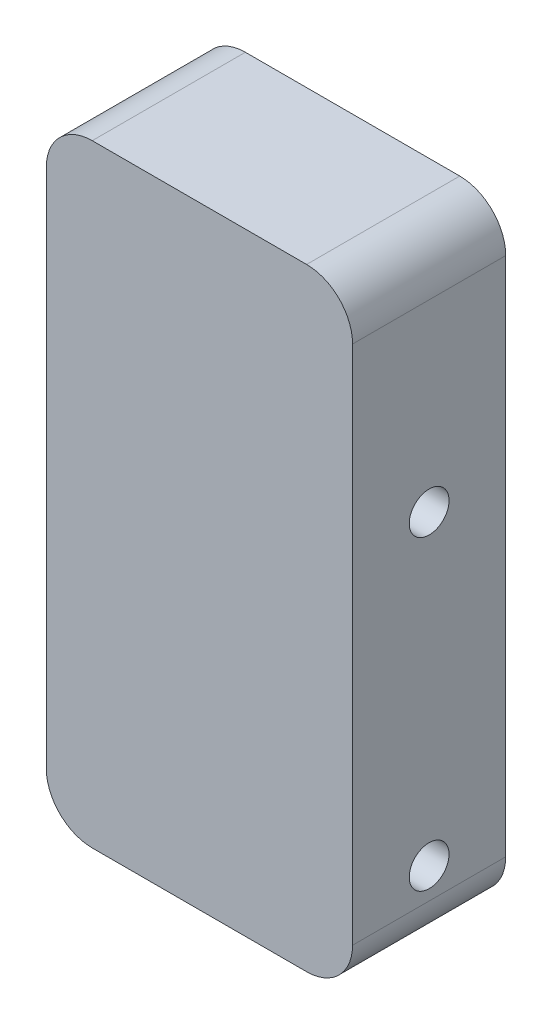
ISO-10303-21;
HEADER;
FILE_DESCRIPTION(('STEP AP214'),'2;1');
FILE_NAME('part.step','',(''),(''),'','','');
FILE_SCHEMA(('AUTOMOTIVE_DESIGN { 1 0 10303 214 1 1 1 1 }'));
ENDSEC;
DATA;
#1=APPLICATION_CONTEXT('core data for automotive mechanical design processes');
#2=APPLICATION_PROTOCOL_DEFINITION('international standard','automotive_design',2000,#1);
#3=PRODUCT_CONTEXT('',#1,'mechanical');
#4=PRODUCT('Part','Part','',(#3));
#5=PRODUCT_RELATED_PRODUCT_CATEGORY('part','',(#4));
#6=PRODUCT_DEFINITION_FORMATION('','',#4);
#7=PRODUCT_DEFINITION_CONTEXT('part definition',#1,'design');
#8=PRODUCT_DEFINITION('design','',#6,#7);
#9=PRODUCT_DEFINITION_SHAPE('','',#8);
#10=(LENGTH_UNIT() NAMED_UNIT(*) SI_UNIT(.MILLI.,.METRE.));
#11=(NAMED_UNIT(*) PLANE_ANGLE_UNIT() SI_UNIT($,.RADIAN.));
#12=(NAMED_UNIT(*) SI_UNIT($,.STERADIAN.) SOLID_ANGLE_UNIT());
#13=UNCERTAINTY_MEASURE_WITH_UNIT(LENGTH_MEASURE(1.E-05),#10,'distance_accuracy_value','');
#14=(GEOMETRIC_REPRESENTATION_CONTEXT(3) GLOBAL_UNCERTAINTY_ASSIGNED_CONTEXT((#13)) GLOBAL_UNIT_ASSIGNED_CONTEXT((#10,
#11,#12)) REPRESENTATION_CONTEXT('',''));
#15=CARTESIAN_POINT('',(0.,0.,0.));
#16=DIRECTION('',(0.,0.,1.));
#17=DIRECTION('',(1.,0.,0.));
#18=AXIS2_PLACEMENT_3D('',#15,#16,#17);
#19=CARTESIAN_POINT('',(-10.,20.,10.));
#20=DIRECTION('',(1.,0.,0.));
#21=DIRECTION('',(0.,1.,0.));
#22=AXIS2_PLACEMENT_3D('',#19,#20,#21);
#23=PLANE('',#22);
#24=DIRECTION('',(0.,-1.,0.));
#25=VECTOR('',#24,1.);
#26=CARTESIAN_POINT('',(-10.,20.,10.));
#27=LINE('',#26,#25);
#28=CARTESIAN_POINT('',(-10.,17.,10.));
#29=VERTEX_POINT('',#28);
#30=CARTESIAN_POINT('',(-10.,-17.,10.));
#31=VERTEX_POINT('',#30);
#32=EDGE_CURVE('E120',#29,#31,#27,.T.);
#33=ORIENTED_EDGE('',*,*,#32,.F.);
#34=DIRECTION('',(0.,0.,-1.));
#35=VECTOR('',#34,1.);
#36=CARTESIAN_POINT('',(-10.,17.,10.));
#37=LINE('',#36,#35);
#38=CARTESIAN_POINT('',(-10.,17.,0.));
#39=VERTEX_POINT('',#38);
#40=EDGE_CURVE('E105',#29,#39,#37,.T.);
#41=ORIENTED_EDGE('',*,*,#40,.T.);
#42=DIRECTION('',(0.,-1.,0.));
#43=VECTOR('',#42,1.);
#44=CARTESIAN_POINT('',(-10.,20.,0.));
#45=LINE('',#44,#43);
#46=CARTESIAN_POINT('',(-10.,-17.,0.));
#47=VERTEX_POINT('',#46);
#48=EDGE_CURVE('E117',#39,#47,#45,.T.);
#49=ORIENTED_EDGE('',*,*,#48,.T.);
#50=DIRECTION('',(0.,0.,-1.));
#51=VECTOR('',#50,1.);
#52=CARTESIAN_POINT('',(-10.,-17.,10.));
#53=LINE('',#52,#51);
#54=EDGE_CURVE('E122',#47,#31,#53,.F.);
#55=ORIENTED_EDGE('',*,*,#54,.T.);
#56=EDGE_LOOP('',(#33,#41,#49,#55));
#57=FACE_BOUND('',#56,.T.);
#58=ADVANCED_FACE('F35',(#57),#23,.F.);
#59=CARTESIAN_POINT('',(10.,-20.,10.));
#60=DIRECTION('',(0.,1.,0.));
#61=DIRECTION('',(-1.,0.,0.));
#62=AXIS2_PLACEMENT_3D('',#59,#60,#61);
#63=PLANE('',#62);
#64=DIRECTION('',(1.,0.,0.));
#65=VECTOR('',#64,1.);
#66=CARTESIAN_POINT('',(10.,-20.,10.));
#67=LINE('',#66,#65);
#68=CARTESIAN_POINT('',(-7.,-20.,10.));
#69=VERTEX_POINT('',#68);
#70=CARTESIAN_POINT('',(7.,-20.,10.));
#71=VERTEX_POINT('',#70);
#72=EDGE_CURVE('E166',#69,#71,#67,.T.);
#73=ORIENTED_EDGE('',*,*,#72,.F.);
#74=DIRECTION('',(0.,0.,-1.));
#75=VECTOR('',#74,1.);
#76=CARTESIAN_POINT('',(-7.,-20.,10.));
#77=LINE('',#76,#75);
#78=CARTESIAN_POINT('',(-7.,-20.,0.));
#79=VERTEX_POINT('',#78);
#80=EDGE_CURVE('E159',#69,#79,#77,.T.);
#81=ORIENTED_EDGE('',*,*,#80,.T.);
#82=DIRECTION('',(1.,0.,0.));
#83=VECTOR('',#82,1.);
#84=CARTESIAN_POINT('',(10.,-20.,0.));
#85=LINE('',#84,#83);
#86=CARTESIAN_POINT('',(7.,-20.,0.));
#87=VERTEX_POINT('',#86);
#88=EDGE_CURVE('E126',#79,#87,#85,.T.);
#89=ORIENTED_EDGE('',*,*,#88,.T.);
#90=DIRECTION('',(0.,0.,-1.));
#91=VECTOR('',#90,1.);
#92=CARTESIAN_POINT('',(7.,-20.,10.));
#93=LINE('',#92,#91);
#94=EDGE_CURVE('E157',#87,#71,#93,.F.);
#95=ORIENTED_EDGE('',*,*,#94,.T.);
#96=EDGE_LOOP('',(#73,#81,#89,#95));
#97=FACE_BOUND('',#96,.T.);
#98=ADVANCED_FACE('F164',(#97),#63,.F.);
#99=CARTESIAN_POINT('',(9.99999999999999,20.,10.));
#100=DIRECTION('',(-1.,0.,0.));
#101=DIRECTION('',(0.,-1.,0.));
#102=AXIS2_PLACEMENT_3D('',#99,#100,#101);
#103=PLANE('',#102);
#104=CARTESIAN_POINT('',(10.,-15.,5.));
#105=DIRECTION('',(1.,0.,0.));
#106=DIRECTION('',(0.,0.,-1.));
#107=AXIS2_PLACEMENT_3D('',#104,#105,#106);
#108=CIRCLE('',#107,1.3);
#109=CARTESIAN_POINT('',(10.,-15.,3.7));
#110=VERTEX_POINT('',#109);
#111=EDGE_CURVE('E133',#110,#110,#108,.T.);
#112=ORIENTED_EDGE('',*,*,#111,.F.);
#113=EDGE_LOOP('',(#112));
#114=FACE_BOUND('',#113,.T.);
#115=CARTESIAN_POINT('',(10.,5.00000000000001,5.));
#116=DIRECTION('',(1.,0.,0.));
#117=DIRECTION('',(0.,0.,-1.));
#118=AXIS2_PLACEMENT_3D('',#115,#116,#117);
#119=CIRCLE('',#118,1.3);
#120=CARTESIAN_POINT('',(10.,5.00000000000001,3.7));
#121=VERTEX_POINT('',#120);
#122=EDGE_CURVE('E180',#121,#121,#119,.T.);
#123=ORIENTED_EDGE('',*,*,#122,.F.);
#124=EDGE_LOOP('',(#123));
#125=FACE_BOUND('',#124,.T.);
#126=DIRECTION('',(0.,1.,0.));
#127=VECTOR('',#126,1.);
#128=CARTESIAN_POINT('',(9.99999999999999,20.,10.));
#129=LINE('',#128,#127);
#130=CARTESIAN_POINT('',(10.,-17.,10.));
#131=VERTEX_POINT('',#130);
#132=CARTESIAN_POINT('',(9.99999999999999,17.,10.));
#133=VERTEX_POINT('',#132);
#134=EDGE_CURVE('E174',#131,#133,#129,.T.);
#135=ORIENTED_EDGE('',*,*,#134,.F.);
#136=DIRECTION('',(0.,0.,-1.));
#137=VECTOR('',#136,1.);
#138=CARTESIAN_POINT('',(10.,-17.,10.));
#139=LINE('',#138,#137);
#140=CARTESIAN_POINT('',(10.,-17.,0.));
#141=VERTEX_POINT('',#140);
#142=EDGE_CURVE('E11',#131,#141,#139,.T.);
#143=ORIENTED_EDGE('',*,*,#142,.T.);
#144=DIRECTION('',(0.,1.,0.));
#145=VECTOR('',#144,1.);
#146=CARTESIAN_POINT('',(9.99999999999999,20.,0.));
#147=LINE('',#146,#145);
#148=CARTESIAN_POINT('',(9.99999999999999,17.,0.));
#149=VERTEX_POINT('',#148);
#150=EDGE_CURVE('E130',#141,#149,#147,.T.);
#151=ORIENTED_EDGE('',*,*,#150,.T.);
#152=DIRECTION('',(0.,0.,-1.));
#153=VECTOR('',#152,1.);
#154=CARTESIAN_POINT('',(9.99999999999999,17.,10.));
#155=LINE('',#154,#153);
#156=EDGE_CURVE('E43',#149,#133,#155,.F.);
#157=ORIENTED_EDGE('',*,*,#156,.T.);
#158=EDGE_LOOP('',(#135,#143,#151,#157));
#159=FACE_BOUND('',#158,.T.);
#160=ADVANCED_FACE('F173',(#114,#125,#159),#103,.F.);
#161=CARTESIAN_POINT('',(9.99999999999999,20.,10.));
#162=DIRECTION('',(0.,-1.,0.));
#163=DIRECTION('',(1.,0.,0.));
#164=AXIS2_PLACEMENT_3D('',#161,#162,#163);
#165=PLANE('',#164);
#166=DIRECTION('',(-1.,0.,0.));
#167=VECTOR('',#166,1.);
#168=CARTESIAN_POINT('',(9.99999999999999,20.,0.));
#169=LINE('',#168,#167);
#170=CARTESIAN_POINT('',(6.99999999999999,20.,0.));
#171=VERTEX_POINT('',#170);
#172=CARTESIAN_POINT('',(-7.00000000000001,20.,0.));
#173=VERTEX_POINT('',#172);
#174=EDGE_CURVE('E140',#171,#173,#169,.T.);
#175=ORIENTED_EDGE('',*,*,#174,.T.);
#176=DIRECTION('',(0.,0.,-1.));
#177=VECTOR('',#176,1.);
#178=CARTESIAN_POINT('',(-7.00000000000001,20.,10.));
#179=LINE('',#178,#177);
#180=CARTESIAN_POINT('',(-7.00000000000001,20.,10.));
#181=VERTEX_POINT('',#180);
#182=EDGE_CURVE('E106',#173,#181,#179,.F.);
#183=ORIENTED_EDGE('',*,*,#182,.T.);
#184=DIRECTION('',(-1.,0.,0.));
#185=VECTOR('',#184,1.);
#186=CARTESIAN_POINT('',(9.99999999999999,20.,10.));
#187=LINE('',#186,#185);
#188=CARTESIAN_POINT('',(6.99999999999999,20.,10.));
#189=VERTEX_POINT('',#188);
#190=EDGE_CURVE('E136',#189,#181,#187,.T.);
#191=ORIENTED_EDGE('',*,*,#190,.F.);
#192=DIRECTION('',(0.,0.,-1.));
#193=VECTOR('',#192,1.);
#194=CARTESIAN_POINT('',(6.99999999999999,20.,10.));
#195=LINE('',#194,#193);
#196=EDGE_CURVE('E111',#189,#171,#195,.T.);
#197=ORIENTED_EDGE('',*,*,#196,.T.);
#198=EDGE_LOOP('',(#175,#183,#191,#197));
#199=FACE_BOUND('',#198,.T.);
#200=ADVANCED_FACE('F193',(#199),#165,.F.);
#201=CARTESIAN_POINT('',(0.,0.,10.));
#202=DIRECTION('',(0.,0.,-1.));
#203=DIRECTION('',(-1.,0.,0.));
#204=AXIS2_PLACEMENT_3D('',#201,#202,#203);
#205=PLANE('',#204);
#206=ORIENTED_EDGE('',*,*,#190,.T.);
#207=CARTESIAN_POINT('',(-7.,17.,10.));
#208=DIRECTION('',(0.,0.,-1.));
#209=DIRECTION('',(-1.,0.,0.));
#210=AXIS2_PLACEMENT_3D('',#207,#208,#209);
#211=CIRCLE('',#210,3.);
#212=EDGE_CURVE('E155',#181,#29,#211,.F.);
#213=ORIENTED_EDGE('',*,*,#212,.T.);
#214=ORIENTED_EDGE('',*,*,#32,.T.);
#215=CARTESIAN_POINT('',(-7.,-17.,10.));
#216=DIRECTION('',(0.,0.,-1.));
#217=DIRECTION('',(-1.,0.,0.));
#218=AXIS2_PLACEMENT_3D('',#215,#216,#217);
#219=CIRCLE('',#218,3.);
#220=EDGE_CURVE('E153',#31,#69,#219,.F.);
#221=ORIENTED_EDGE('',*,*,#220,.T.);
#222=ORIENTED_EDGE('',*,*,#72,.T.);
#223=CARTESIAN_POINT('',(7.,-17.,10.));
#224=DIRECTION('',(0.,0.,-1.));
#225=DIRECTION('',(-1.,0.,0.));
#226=AXIS2_PLACEMENT_3D('',#223,#224,#225);
#227=CIRCLE('',#226,3.);
#228=EDGE_CURVE('E56',#71,#131,#227,.F.);
#229=ORIENTED_EDGE('',*,*,#228,.T.);
#230=ORIENTED_EDGE('',*,*,#134,.T.);
#231=CARTESIAN_POINT('',(7.,17.,10.));
#232=DIRECTION('',(0.,0.,-1.));
#233=DIRECTION('',(-1.,0.,0.));
#234=AXIS2_PLACEMENT_3D('',#231,#232,#233);
#235=CIRCLE('',#234,3.);
#236=EDGE_CURVE('E150',#133,#189,#235,.F.);
#237=ORIENTED_EDGE('',*,*,#236,.T.);
#238=EDGE_LOOP('',(#206,#213,#214,#221,#222,#229,#230,#237));
#239=FACE_BOUND('',#238,.T.);
#240=ADVANCED_FACE('F279',(#239),#205,.F.);
#241=CARTESIAN_POINT('',(0.,0.,0.));
#242=DIRECTION('',(0.,0.,-1.));
#243=DIRECTION('',(-1.,0.,0.));
#244=AXIS2_PLACEMENT_3D('',#241,#242,#243);
#245=PLANE('',#244);
#246=ORIENTED_EDGE('',*,*,#48,.F.);
#247=CARTESIAN_POINT('',(-7.,17.,0.));
#248=DIRECTION('',(0.,0.,-1.));
#249=DIRECTION('',(-1.,0.,0.));
#250=AXIS2_PLACEMENT_3D('',#247,#248,#249);
#251=CIRCLE('',#250,3.);
#252=EDGE_CURVE('E101',#39,#173,#251,.T.);
#253=ORIENTED_EDGE('',*,*,#252,.T.);
#254=ORIENTED_EDGE('',*,*,#174,.F.);
#255=CARTESIAN_POINT('',(7.,17.,0.));
#256=DIRECTION('',(0.,0.,-1.));
#257=DIRECTION('',(-1.,0.,0.));
#258=AXIS2_PLACEMENT_3D('',#255,#256,#257);
#259=CIRCLE('',#258,3.);
#260=EDGE_CURVE('E121',#171,#149,#259,.T.);
#261=ORIENTED_EDGE('',*,*,#260,.T.);
#262=ORIENTED_EDGE('',*,*,#150,.F.);
#263=CARTESIAN_POINT('',(7.,-17.,0.));
#264=DIRECTION('',(0.,0.,-1.));
#265=DIRECTION('',(-1.,0.,0.));
#266=AXIS2_PLACEMENT_3D('',#263,#264,#265);
#267=CIRCLE('',#266,3.);
#268=EDGE_CURVE('E144',#141,#87,#267,.T.);
#269=ORIENTED_EDGE('',*,*,#268,.T.);
#270=ORIENTED_EDGE('',*,*,#88,.F.);
#271=CARTESIAN_POINT('',(-7.,-17.,0.));
#272=DIRECTION('',(0.,0.,-1.));
#273=DIRECTION('',(-1.,0.,0.));
#274=AXIS2_PLACEMENT_3D('',#271,#272,#273);
#275=CIRCLE('',#274,3.);
#276=EDGE_CURVE('E112',#79,#47,#275,.T.);
#277=ORIENTED_EDGE('',*,*,#276,.T.);
#278=EDGE_LOOP('',(#246,#253,#254,#261,#262,#269,#270,#277));
#279=FACE_BOUND('',#278,.T.);
#280=ADVANCED_FACE('F124',(#279),#245,.T.);
#281=CARTESIAN_POINT('',(-7.,17.,10.));
#282=DIRECTION('',(0.,0.,-1.));
#283=DIRECTION('',(-1.,0.,0.));
#284=AXIS2_PLACEMENT_3D('',#281,#282,#283);
#285=CYLINDRICAL_SURFACE('',#284,3.);
#286=ORIENTED_EDGE('',*,*,#212,.F.);
#287=ORIENTED_EDGE('',*,*,#182,.F.);
#288=ORIENTED_EDGE('',*,*,#252,.F.);
#289=ORIENTED_EDGE('',*,*,#40,.F.);
#290=EDGE_LOOP('',(#286,#287,#288,#289));
#291=FACE_BOUND('',#290,.T.);
#292=ADVANCED_FACE('F104',(#291),#285,.T.);
#293=CARTESIAN_POINT('',(-7.,-17.,10.));
#294=DIRECTION('',(0.,0.,-1.));
#295=DIRECTION('',(-1.,0.,0.));
#296=AXIS2_PLACEMENT_3D('',#293,#294,#295);
#297=CYLINDRICAL_SURFACE('',#296,3.);
#298=ORIENTED_EDGE('',*,*,#220,.F.);
#299=ORIENTED_EDGE('',*,*,#54,.F.);
#300=ORIENTED_EDGE('',*,*,#276,.F.);
#301=ORIENTED_EDGE('',*,*,#80,.F.);
#302=EDGE_LOOP('',(#298,#299,#300,#301));
#303=FACE_BOUND('',#302,.T.);
#304=ADVANCED_FACE('F220',(#303),#297,.T.);
#305=CARTESIAN_POINT('',(7.,-17.,10.));
#306=DIRECTION('',(0.,0.,-1.));
#307=DIRECTION('',(-1.,0.,0.));
#308=AXIS2_PLACEMENT_3D('',#305,#306,#307);
#309=CYLINDRICAL_SURFACE('',#308,3.);
#310=ORIENTED_EDGE('',*,*,#228,.F.);
#311=ORIENTED_EDGE('',*,*,#94,.F.);
#312=ORIENTED_EDGE('',*,*,#268,.F.);
#313=ORIENTED_EDGE('',*,*,#142,.F.);
#314=EDGE_LOOP('',(#310,#311,#312,#313));
#315=FACE_BOUND('',#314,.T.);
#316=ADVANCED_FACE('F172',(#315),#309,.T.);
#317=CARTESIAN_POINT('',(7.,17.,10.));
#318=DIRECTION('',(0.,0.,-1.));
#319=DIRECTION('',(-1.,0.,0.));
#320=AXIS2_PLACEMENT_3D('',#317,#318,#319);
#321=CYLINDRICAL_SURFACE('',#320,3.);
#322=ORIENTED_EDGE('',*,*,#236,.F.);
#323=ORIENTED_EDGE('',*,*,#156,.F.);
#324=ORIENTED_EDGE('',*,*,#260,.F.);
#325=ORIENTED_EDGE('',*,*,#196,.F.);
#326=EDGE_LOOP('',(#322,#323,#324,#325));
#327=FACE_BOUND('',#326,.T.);
#328=ADVANCED_FACE('F37',(#327),#321,.T.);
#329=CARTESIAN_POINT('',(-5.,5.00000000000001,5.));
#330=DIRECTION('',(1.,0.,0.));
#331=DIRECTION('',(0.,0.,-1.));
#332=AXIS2_PLACEMENT_3D('',#329,#330,#331);
#333=CYLINDRICAL_SURFACE('',#332,1.3);
#334=CARTESIAN_POINT('',(-5.,5.00000000000001,5.));
#335=DIRECTION('',(1.,0.,0.));
#336=DIRECTION('',(0.,0.,-1.));
#337=AXIS2_PLACEMENT_3D('',#334,#335,#336);
#338=CIRCLE('',#337,1.3);
#339=CARTESIAN_POINT('',(-5.,5.00000000000001,3.7));
#340=VERTEX_POINT('',#339);
#341=EDGE_CURVE('E183',#340,#340,#338,.T.);
#342=ORIENTED_EDGE('',*,*,#341,.F.);
#343=EDGE_LOOP('',(#342));
#344=FACE_BOUND('',#343,.T.);
#345=ORIENTED_EDGE('',*,*,#122,.T.);
#346=EDGE_LOOP('',(#345));
#347=FACE_BOUND('',#346,.T.);
#348=ADVANCED_FACE('F197',(#344,#347),#333,.F.);
#349=CARTESIAN_POINT('',(-5.,5.00000000000001,5.));
#350=DIRECTION('',(1.,0.,0.));
#351=DIRECTION('',(0.,0.,-1.));
#352=AXIS2_PLACEMENT_3D('',#349,#350,#351);
#353=PLANE('',#352);
#354=ORIENTED_EDGE('',*,*,#341,.T.);
#355=EDGE_LOOP('',(#354));
#356=FACE_BOUND('',#355,.T.);
#357=ADVANCED_FACE('F199',(#356),#353,.T.);
#358=CARTESIAN_POINT('',(-5.,-15.,5.));
#359=DIRECTION('',(1.,0.,0.));
#360=DIRECTION('',(0.,0.,-1.));
#361=AXIS2_PLACEMENT_3D('',#358,#359,#360);
#362=CYLINDRICAL_SURFACE('',#361,1.3);
#363=CARTESIAN_POINT('',(-5.,-15.,5.));
#364=DIRECTION('',(1.,0.,0.));
#365=DIRECTION('',(0.,0.,-1.));
#366=AXIS2_PLACEMENT_3D('',#363,#364,#365);
#367=CIRCLE('',#366,1.3);
#368=CARTESIAN_POINT('',(-5.,-15.,3.7));
#369=VERTEX_POINT('',#368);
#370=EDGE_CURVE('E127',#369,#369,#367,.T.);
#371=ORIENTED_EDGE('',*,*,#370,.F.);
#372=EDGE_LOOP('',(#371));
#373=FACE_BOUND('',#372,.T.);
#374=ORIENTED_EDGE('',*,*,#111,.T.);
#375=EDGE_LOOP('',(#374));
#376=FACE_BOUND('',#375,.T.);
#377=ADVANCED_FACE('F189',(#373,#376),#362,.F.);
#378=CARTESIAN_POINT('',(-5.,-15.,5.));
#379=DIRECTION('',(1.,0.,0.));
#380=DIRECTION('',(0.,0.,-1.));
#381=AXIS2_PLACEMENT_3D('',#378,#379,#380);
#382=PLANE('',#381);
#383=ORIENTED_EDGE('',*,*,#370,.T.);
#384=EDGE_LOOP('',(#383));
#385=FACE_BOUND('',#384,.T.);
#386=ADVANCED_FACE('F259',(#385),#382,.T.);
#387=CLOSED_SHELL('',(#58,#98,#160,#200,#240,#280,#292,#304,#316,#328,#348,#357,#377,#386));
#388=MANIFOLD_SOLID_BREP('B2',#387);
#389=ADVANCED_BREP_SHAPE_REPRESENTATION('',(#18,#388),#14);
#390=SHAPE_DEFINITION_REPRESENTATION(#9,#389);
ENDSEC;
END-ISO-10303-21;
